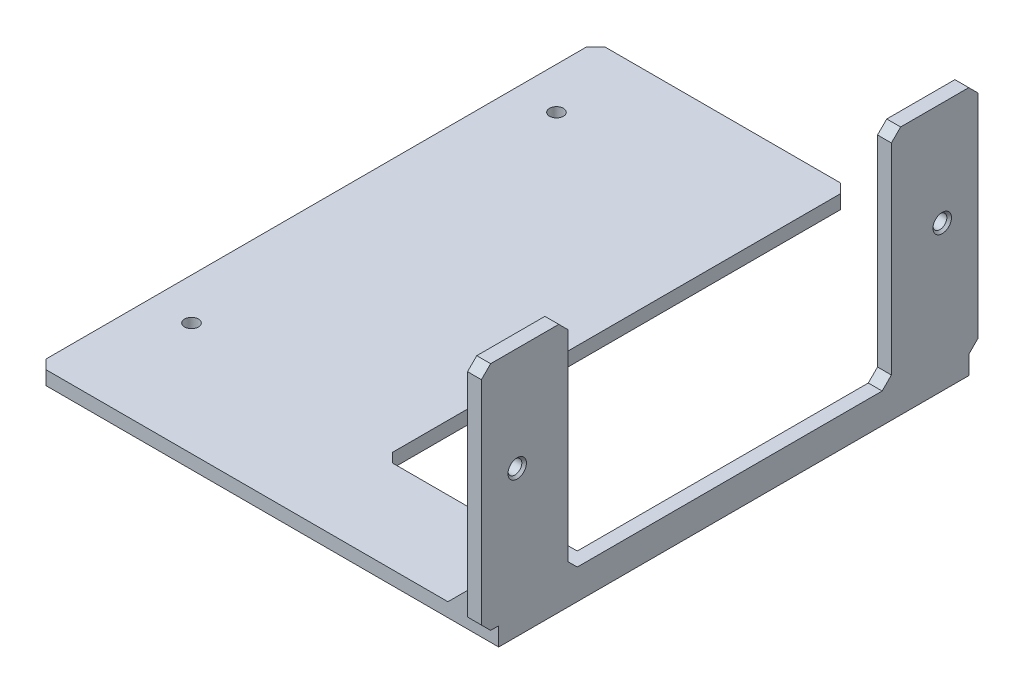
ISO-10303-21;
HEADER;
FILE_DESCRIPTION(('STEP AP214'),'2;1');
FILE_NAME('part.step','',(''),(''),'','','');
FILE_SCHEMA(('AUTOMOTIVE_DESIGN { 1 0 10303 214 1 1 1 1 }'));
ENDSEC;
DATA;
#1=APPLICATION_CONTEXT('core data for automotive mechanical design processes');
#2=APPLICATION_PROTOCOL_DEFINITION('international standard','automotive_design',2000,#1);
#3=PRODUCT_CONTEXT('',#1,'mechanical');
#4=PRODUCT('Part','Part','',(#3));
#5=PRODUCT_RELATED_PRODUCT_CATEGORY('part','',(#4));
#6=PRODUCT_DEFINITION_FORMATION('','',#4);
#7=PRODUCT_DEFINITION_CONTEXT('part definition',#1,'design');
#8=PRODUCT_DEFINITION('design','',#6,#7);
#9=PRODUCT_DEFINITION_SHAPE('','',#8);
#10=(LENGTH_UNIT() NAMED_UNIT(*) SI_UNIT(.MILLI.,.METRE.));
#11=(NAMED_UNIT(*) PLANE_ANGLE_UNIT() SI_UNIT($,.RADIAN.));
#12=(NAMED_UNIT(*) SI_UNIT($,.STERADIAN.) SOLID_ANGLE_UNIT());
#13=UNCERTAINTY_MEASURE_WITH_UNIT(LENGTH_MEASURE(1.E-05),#10,'distance_accuracy_value','');
#14=(GEOMETRIC_REPRESENTATION_CONTEXT(3) GLOBAL_UNCERTAINTY_ASSIGNED_CONTEXT((#13)) GLOBAL_UNIT_ASSIGNED_CONTEXT((#10,
#11,#12)) REPRESENTATION_CONTEXT('',''));
#15=CARTESIAN_POINT('',(0.,0.,0.));
#16=DIRECTION('',(0.,0.,1.));
#17=DIRECTION('',(1.,0.,0.));
#18=AXIS2_PLACEMENT_3D('',#15,#16,#17);
#19=CARTESIAN_POINT('',(0.,-27.5,30.));
#20=DIRECTION('',(0.,0.,-1.));
#21=DIRECTION('',(-1.,0.,0.));
#22=AXIS2_PLACEMENT_3D('',#19,#20,#21);
#23=PLANE('',#22);
#24=DIRECTION('',(0.,-1.,0.));
#25=VECTOR('',#24,1.);
#26=CARTESIAN_POINT('',(0.,-28.5,30.));
#27=LINE('',#26,#25);
#28=CARTESIAN_POINT('',(0.,-25.,30.));
#29=VERTEX_POINT('',#28);
#30=CARTESIAN_POINT('',(0.,-31.5,30.));
#31=VERTEX_POINT('',#30);
#32=EDGE_CURVE('E395',#29,#31,#27,.T.);
#33=ORIENTED_EDGE('',*,*,#32,.T.);
#34=DIRECTION('',(1.,0.,0.));
#35=VECTOR('',#34,1.);
#36=CARTESIAN_POINT('',(3.,-31.5,30.));
#37=LINE('',#36,#35);
#38=CARTESIAN_POINT('',(-40.,-31.5,30.));
#39=VERTEX_POINT('',#38);
#40=EDGE_CURVE('E392',#39,#31,#37,.T.);
#41=ORIENTED_EDGE('',*,*,#40,.F.);
#42=DIRECTION('',(0.,1.,0.));
#43=VECTOR('',#42,1.);
#44=CARTESIAN_POINT('',(-40.,-27.5,30.));
#45=LINE('',#44,#43);
#46=CARTESIAN_POINT('',(-40.,-28.5,30.));
#47=VERTEX_POINT('',#46);
#48=EDGE_CURVE('E373',#39,#47,#45,.T.);
#49=ORIENTED_EDGE('',*,*,#48,.T.);
#50=DIRECTION('',(1.,0.,0.));
#51=VECTOR('',#50,1.);
#52=CARTESIAN_POINT('',(3.,-28.5,30.));
#53=LINE('',#52,#51);
#54=CARTESIAN_POINT('',(-8.,-28.5,30.));
#55=VERTEX_POINT('',#54);
#56=EDGE_CURVE('E382',#47,#55,#53,.T.);
#57=ORIENTED_EDGE('',*,*,#56,.T.);
#58=DIRECTION('',(0.707106781186548,0.707106781186547,0.));
#59=VECTOR('',#58,1.);
#60=CARTESIAN_POINT('',(0.,-20.5,30.));
#61=LINE('',#60,#59);
#62=CARTESIAN_POINT('',(-4.5,-25.,30.));
#63=VERTEX_POINT('',#62);
#64=EDGE_CURVE('E534',#55,#63,#61,.T.);
#65=ORIENTED_EDGE('',*,*,#64,.T.);
#66=DIRECTION('',(-1.,0.,0.));
#67=VECTOR('',#66,1.);
#68=CARTESIAN_POINT('',(0.,-25.,30.));
#69=LINE('',#68,#67);
#70=EDGE_CURVE('E513',#29,#63,#69,.T.);
#71=ORIENTED_EDGE('',*,*,#70,.F.);
#72=EDGE_LOOP('',(#33,#41,#49,#57,#65,#71));
#73=FACE_BOUND('',#72,.T.);
#74=ADVANCED_FACE('F43',(#73),#23,.T.);
#75=CARTESIAN_POINT('',(3.,22.5,53.75));
#76=DIRECTION('',(0.,-1.,0.));
#77=DIRECTION('',(0.,0.,-1.));
#78=AXIS2_PLACEMENT_3D('',#75,#76,#77);
#79=PLANE('',#78);
#80=DIRECTION('',(0.,0.,1.));
#81=VECTOR('',#80,1.);
#82=CARTESIAN_POINT('',(3.,22.5,53.75));
#83=LINE('',#82,#81);
#84=CARTESIAN_POINT('',(3.,22.5,37.));
#85=VERTEX_POINT('',#84);
#86=CARTESIAN_POINT('',(3.,22.5,51.75));
#87=VERTEX_POINT('',#86);
#88=EDGE_CURVE('E436',#85,#87,#83,.T.);
#89=ORIENTED_EDGE('',*,*,#88,.F.);
#90=DIRECTION('',(-1.,0.,0.));
#91=VECTOR('',#90,1.);
#92=CARTESIAN_POINT('',(3.,22.5,37.));
#93=LINE('',#92,#91);
#94=CARTESIAN_POINT('',(0.,22.5,37.));
#95=VERTEX_POINT('',#94);
#96=EDGE_CURVE('E341',#85,#95,#93,.T.);
#97=ORIENTED_EDGE('',*,*,#96,.T.);
#98=DIRECTION('',(0.,0.,1.));
#99=VECTOR('',#98,1.);
#100=CARTESIAN_POINT('',(0.,22.5,53.75));
#101=LINE('',#100,#99);
#102=CARTESIAN_POINT('',(0.,22.5,51.75));
#103=VERTEX_POINT('',#102);
#104=EDGE_CURVE('E449',#95,#103,#101,.T.);
#105=ORIENTED_EDGE('',*,*,#104,.T.);
#106=DIRECTION('',(1.,0.,0.));
#107=VECTOR('',#106,1.);
#108=CARTESIAN_POINT('',(3.,22.5,51.75));
#109=LINE('',#108,#107);
#110=EDGE_CURVE('E270',#103,#87,#109,.T.);
#111=ORIENTED_EDGE('',*,*,#110,.T.);
#112=EDGE_LOOP('',(#89,#97,#105,#111));
#113=FACE_BOUND('',#112,.T.);
#114=ADVANCED_FACE('F623',(#113),#79,.F.);
#115=CARTESIAN_POINT('',(0.,0.,0.));
#116=DIRECTION('',(1.,0.,0.));
#117=DIRECTION('',(0.,0.,-1.));
#118=AXIS2_PLACEMENT_3D('',#115,#116,#117);
#119=PLANE('',#118);
#120=CARTESIAN_POINT('',(0.,0.,46.));
#121=DIRECTION('',(1.,0.,0.));
#122=DIRECTION('',(0.,0.,-1.));
#123=AXIS2_PLACEMENT_3D('',#120,#121,#122);
#124=CIRCLE('',#123,1.5);
#125=CARTESIAN_POINT('',(0.,0.,44.5));
#126=VERTEX_POINT('',#125);
#127=EDGE_CURVE('E420',#126,#126,#124,.T.);
#128=ORIENTED_EDGE('',*,*,#127,.T.);
#129=EDGE_LOOP('',(#128));
#130=FACE_BOUND('',#129,.T.);
#131=ORIENTED_EDGE('',*,*,#104,.F.);
#132=DIRECTION('',(0.,0.707106781186545,0.70710678118655));
#133=VECTOR('',#132,1.);
#134=CARTESIAN_POINT('',(0.,20.5,35.));
#135=LINE('',#134,#133);
#136=CARTESIAN_POINT('',(0.,20.5,35.));
#137=VERTEX_POINT('',#136);
#138=EDGE_CURVE('E343',#95,#137,#135,.F.);
#139=ORIENTED_EDGE('',*,*,#138,.T.);
#140=DIRECTION('',(0.,-1.,0.));
#141=VECTOR('',#140,1.);
#142=CARTESIAN_POINT('',(0.,0.,35.));
#143=LINE('',#142,#141);
#144=CARTESIAN_POINT('',(0.,-20.5,35.));
#145=VERTEX_POINT('',#144);
#146=EDGE_CURVE('E498',#137,#145,#143,.T.);
#147=ORIENTED_EDGE('',*,*,#146,.T.);
#148=DIRECTION('',(0.,0.,-1.));
#149=VECTOR('',#148,1.);
#150=CARTESIAN_POINT('',(0.,-20.5,50.));
#151=LINE('',#150,#149);
#152=CARTESIAN_POINT('',(0.,-20.5,50.));
#153=VERTEX_POINT('',#152);
#154=EDGE_CURVE('E409',#153,#145,#151,.T.);
#155=ORIENTED_EDGE('',*,*,#154,.F.);
#156=DIRECTION('',(0.,-1.,0.));
#157=VECTOR('',#156,1.);
#158=CARTESIAN_POINT('',(0.,-28.5,50.));
#159=LINE('',#158,#157);
#160=CARTESIAN_POINT('',(0.,-27.5,50.));
#161=VERTEX_POINT('',#160);
#162=EDGE_CURVE('E531',#153,#161,#159,.T.);
#163=ORIENTED_EDGE('',*,*,#162,.T.);
#164=DIRECTION('',(0.,0.,-1.));
#165=VECTOR('',#164,1.);
#166=CARTESIAN_POINT('',(0.,-27.5,53.75));
#167=LINE('',#166,#165);
#168=CARTESIAN_POINT('',(0.,-27.5,51.75));
#169=VERTEX_POINT('',#168);
#170=EDGE_CURVE('E443',#169,#161,#167,.T.);
#171=ORIENTED_EDGE('',*,*,#170,.F.);
#172=DIRECTION('',(0.,-0.707106781186548,-0.707106781186548));
#173=VECTOR('',#172,1.);
#174=CARTESIAN_POINT('',(0.,-27.5,51.75));
#175=LINE('',#174,#173);
#176=CARTESIAN_POINT('',(0.,-25.5,53.75));
#177=VERTEX_POINT('',#176);
#178=EDGE_CURVE('E457',#169,#177,#175,.F.);
#179=ORIENTED_EDGE('',*,*,#178,.T.);
#180=DIRECTION('',(0.,-1.,0.));
#181=VECTOR('',#180,1.);
#182=CARTESIAN_POINT('',(0.,22.5,53.75));
#183=LINE('',#182,#181);
#184=CARTESIAN_POINT('',(0.,20.5,53.75));
#185=VERTEX_POINT('',#184);
#186=EDGE_CURVE('E424',#185,#177,#183,.T.);
#187=ORIENTED_EDGE('',*,*,#186,.F.);
#188=DIRECTION('',(0.,-0.707106781186548,0.707106781186548));
#189=VECTOR('',#188,1.);
#190=CARTESIAN_POINT('',(0.,20.5,53.75));
#191=LINE('',#190,#189);
#192=EDGE_CURVE('E454',#185,#103,#191,.F.);
#193=ORIENTED_EDGE('',*,*,#192,.T.);
#194=EDGE_LOOP('',(#131,#139,#147,#155,#163,#171,#179,#187,#193));
#195=FACE_BOUND('',#194,.T.);
#196=ADVANCED_FACE('F478',(#130,#195),#119,.F.);
#197=CARTESIAN_POINT('',(3.,-27.5,53.75));
#198=DIRECTION('',(0.,1.,0.));
#199=DIRECTION('',(0.,0.,1.));
#200=AXIS2_PLACEMENT_3D('',#197,#198,#199);
#201=PLANE('',#200);
#202=ORIENTED_EDGE('',*,*,#170,.T.);
#203=DIRECTION('',(1.,0.,0.));
#204=VECTOR('',#203,1.);
#205=CARTESIAN_POINT('',(0.,-27.5,50.));
#206=LINE('',#205,#204);
#207=CARTESIAN_POINT('',(3.,-27.5,50.));
#208=VERTEX_POINT('',#207);
#209=EDGE_CURVE('E417',#161,#208,#206,.T.);
#210=ORIENTED_EDGE('',*,*,#209,.T.);
#211=DIRECTION('',(0.,0.,-1.));
#212=VECTOR('',#211,1.);
#213=CARTESIAN_POINT('',(3.,-27.5,53.75));
#214=LINE('',#213,#212);
#215=CARTESIAN_POINT('',(3.,-27.5,51.75));
#216=VERTEX_POINT('',#215);
#217=EDGE_CURVE('E430',#216,#208,#214,.T.);
#218=ORIENTED_EDGE('',*,*,#217,.F.);
#219=DIRECTION('',(-1.,0.,0.));
#220=VECTOR('',#219,1.);
#221=CARTESIAN_POINT('',(3.,-27.5,51.75));
#222=LINE('',#221,#220);
#223=EDGE_CURVE('E264',#216,#169,#222,.T.);
#224=ORIENTED_EDGE('',*,*,#223,.T.);
#225=EDGE_LOOP('',(#202,#210,#218,#224));
#226=FACE_BOUND('',#225,.T.);
#227=ADVANCED_FACE('F472',(#226),#201,.F.);
#228=CARTESIAN_POINT('',(3.,22.5,53.75));
#229=DIRECTION('',(0.,0.,-1.));
#230=DIRECTION('',(0.,1.,0.));
#231=AXIS2_PLACEMENT_3D('',#228,#229,#230);
#232=PLANE('',#231);
#233=ORIENTED_EDGE('',*,*,#186,.T.);
#234=DIRECTION('',(1.,0.,0.));
#235=VECTOR('',#234,1.);
#236=CARTESIAN_POINT('',(3.,-25.5,53.75));
#237=LINE('',#236,#235);
#238=CARTESIAN_POINT('',(3.,-25.5,53.75));
#239=VERTEX_POINT('',#238);
#240=EDGE_CURVE('E285',#177,#239,#237,.T.);
#241=ORIENTED_EDGE('',*,*,#240,.T.);
#242=DIRECTION('',(0.,-1.,0.));
#243=VECTOR('',#242,1.);
#244=CARTESIAN_POINT('',(3.,22.5,53.75));
#245=LINE('',#244,#243);
#246=CARTESIAN_POINT('',(3.,20.5,53.75));
#247=VERTEX_POINT('',#246);
#248=EDGE_CURVE('E427',#247,#239,#245,.T.);
#249=ORIENTED_EDGE('',*,*,#248,.F.);
#250=DIRECTION('',(-1.,0.,0.));
#251=VECTOR('',#250,1.);
#252=CARTESIAN_POINT('',(3.,20.5,53.75));
#253=LINE('',#252,#251);
#254=EDGE_CURVE('E282',#247,#185,#253,.T.);
#255=ORIENTED_EDGE('',*,*,#254,.T.);
#256=EDGE_LOOP('',(#233,#241,#249,#255));
#257=FACE_BOUND('',#256,.T.);
#258=ADVANCED_FACE('F481',(#257),#232,.F.);
#259=CARTESIAN_POINT('',(3.,22.5,-53.75));
#260=DIRECTION('',(0.,0.,1.));
#261=DIRECTION('',(0.,-1.,0.));
#262=AXIS2_PLACEMENT_3D('',#259,#260,#261);
#263=PLANE('',#262);
#264=DIRECTION('',(0.,1.,0.));
#265=VECTOR('',#264,1.);
#266=CARTESIAN_POINT('',(3.,22.5,-53.75));
#267=LINE('',#266,#265);
#268=CARTESIAN_POINT('',(3.,-25.5,-53.75));
#269=VERTEX_POINT('',#268);
#270=CARTESIAN_POINT('',(3.,20.5,-53.75));
#271=VERTEX_POINT('',#270);
#272=EDGE_CURVE('E434',#269,#271,#267,.T.);
#273=ORIENTED_EDGE('',*,*,#272,.F.);
#274=DIRECTION('',(-1.,0.,0.));
#275=VECTOR('',#274,1.);
#276=CARTESIAN_POINT('',(3.,-25.5,-53.75));
#277=LINE('',#276,#275);
#278=CARTESIAN_POINT('',(0.,-25.5,-53.75));
#279=VERTEX_POINT('',#278);
#280=EDGE_CURVE('E269',#269,#279,#277,.T.);
#281=ORIENTED_EDGE('',*,*,#280,.T.);
#282=DIRECTION('',(0.,1.,0.));
#283=VECTOR('',#282,1.);
#284=CARTESIAN_POINT('',(0.,22.5,-53.75));
#285=LINE('',#284,#283);
#286=CARTESIAN_POINT('',(0.,20.5,-53.75));
#287=VERTEX_POINT('',#286);
#288=EDGE_CURVE('E446',#279,#287,#285,.T.);
#289=ORIENTED_EDGE('',*,*,#288,.T.);
#290=DIRECTION('',(1.,0.,0.));
#291=VECTOR('',#290,1.);
#292=CARTESIAN_POINT('',(3.,20.5,-53.75));
#293=LINE('',#292,#291);
#294=EDGE_CURVE('E440',#287,#271,#293,.T.);
#295=ORIENTED_EDGE('',*,*,#294,.T.);
#296=EDGE_LOOP('',(#273,#281,#289,#295));
#297=FACE_BOUND('',#296,.T.);
#298=ADVANCED_FACE('F613',(#297),#263,.F.);
#299=CARTESIAN_POINT('',(0.,22.5,-51.75));
#300=VERTEX_POINT('',#299);
#301=CARTESIAN_POINT('',(0.,22.5,-37.));
#302=VERTEX_POINT('',#301);
#303=EDGE_CURVE('E431',#300,#302,#101,.T.);
#304=ORIENTED_EDGE('',*,*,#303,.T.);
#305=DIRECTION('',(1.,0.,0.));
#306=VECTOR('',#305,1.);
#307=CARTESIAN_POINT('',(3.,22.5,-37.));
#308=LINE('',#307,#306);
#309=CARTESIAN_POINT('',(3.,22.5,-37.));
#310=VERTEX_POINT('',#309);
#311=EDGE_CURVE('E327',#302,#310,#308,.T.);
#312=ORIENTED_EDGE('',*,*,#311,.T.);
#313=CARTESIAN_POINT('',(3.,22.5,-51.75));
#314=VERTEX_POINT('',#313);
#315=EDGE_CURVE('E437',#314,#310,#83,.T.);
#316=ORIENTED_EDGE('',*,*,#315,.F.);
#317=DIRECTION('',(-1.,0.,0.));
#318=VECTOR('',#317,1.);
#319=CARTESIAN_POINT('',(3.,22.5,-51.75));
#320=LINE('',#319,#318);
#321=EDGE_CURVE('E274',#314,#300,#320,.T.);
#322=ORIENTED_EDGE('',*,*,#321,.T.);
#323=EDGE_LOOP('',(#304,#312,#316,#322));
#324=FACE_BOUND('',#323,.T.);
#325=ADVANCED_FACE('F605',(#324),#79,.F.);
#326=CARTESIAN_POINT('',(3.,0.,0.));
#327=DIRECTION('',(1.,0.,0.));
#328=DIRECTION('',(0.,0.,-1.));
#329=AXIS2_PLACEMENT_3D('',#326,#327,#328);
#330=PLANE('',#329);
#331=DIRECTION('',(0.,1.,0.));
#332=VECTOR('',#331,1.);
#333=CARTESIAN_POINT('',(3.,-113.305027351624,-51.75));
#334=LINE('',#333,#332);
#335=CARTESIAN_POINT('',(3.,-31.5,-51.75));
#336=VERTEX_POINT('',#335);
#337=CARTESIAN_POINT('',(3.,-27.5,-51.75));
#338=VERTEX_POINT('',#337);
#339=EDGE_CURVE('E241',#336,#338,#334,.T.);
#340=ORIENTED_EDGE('',*,*,#339,.T.);
#341=DIRECTION('',(0.,-0.707106781186545,0.70710678118655));
#342=VECTOR('',#341,1.);
#343=CARTESIAN_POINT('',(3.,-39.6250000000001,-39.6249999999998));
#344=LINE('',#343,#342);
#345=EDGE_CURVE('E247',#338,#269,#344,.F.);
#346=ORIENTED_EDGE('',*,*,#345,.T.);
#347=ORIENTED_EDGE('',*,*,#272,.T.);
#348=DIRECTION('',(0.,-0.70710678118655,-0.707106781186545));
#349=VECTOR('',#348,1.);
#350=CARTESIAN_POINT('',(3.,37.1249999999999,-37.1250000000002));
#351=LINE('',#350,#349);
#352=EDGE_CURVE('E271',#271,#314,#351,.F.);
#353=ORIENTED_EDGE('',*,*,#352,.T.);
#354=ORIENTED_EDGE('',*,*,#315,.T.);
#355=DIRECTION('',(0.,0.707106781186552,-0.707106781186543));
#356=VECTOR('',#355,1.);
#357=CARTESIAN_POINT('',(3.,-7.25000000000013,-7.25000000000023));
#358=LINE('',#357,#356);
#359=CARTESIAN_POINT('',(3.,20.5,-35.));
#360=VERTEX_POINT('',#359);
#361=EDGE_CURVE('E332',#310,#360,#358,.F.);
#362=ORIENTED_EDGE('',*,*,#361,.T.);
#363=DIRECTION('',(0.,1.,0.));
#364=VECTOR('',#363,1.);
#365=CARTESIAN_POINT('',(3.,22.5,-35.));
#366=LINE('',#365,#364);
#367=CARTESIAN_POINT('',(3.,-23.,-35.));
#368=VERTEX_POINT('',#367);
#369=EDGE_CURVE('E506',#368,#360,#366,.T.);
#370=ORIENTED_EDGE('',*,*,#369,.F.);
#371=DIRECTION('',(0.,0.70710678118655,-0.707106781186545));
#372=VECTOR('',#371,1.);
#373=CARTESIAN_POINT('',(3.,-23.,-35.));
#374=LINE('',#373,#372);
#375=CARTESIAN_POINT('',(3.,-25.,-33.));
#376=VERTEX_POINT('',#375);
#377=EDGE_CURVE('E318',#368,#376,#374,.F.);
#378=ORIENTED_EDGE('',*,*,#377,.T.);
#379=DIRECTION('',(0.,0.,-1.));
#380=VECTOR('',#379,1.);
#381=CARTESIAN_POINT('',(3.,-25.,35.));
#382=LINE('',#381,#380);
#383=CARTESIAN_POINT('',(3.,-25.,33.));
#384=VERTEX_POINT('',#383);
#385=EDGE_CURVE('E502',#384,#376,#382,.T.);
#386=ORIENTED_EDGE('',*,*,#385,.F.);
#387=DIRECTION('',(0.,-0.707106781186543,-0.707106781186552));
#388=VECTOR('',#387,1.);
#389=CARTESIAN_POINT('',(3.,-25.,33.));
#390=LINE('',#389,#388);
#391=CARTESIAN_POINT('',(3.,-23.,35.));
#392=VERTEX_POINT('',#391);
#393=EDGE_CURVE('E322',#384,#392,#390,.F.);
#394=ORIENTED_EDGE('',*,*,#393,.T.);
#395=DIRECTION('',(0.,-1.,0.));
#396=VECTOR('',#395,1.);
#397=CARTESIAN_POINT('',(3.,22.5,35.));
#398=LINE('',#397,#396);
#399=CARTESIAN_POINT('',(3.,20.5,35.));
#400=VERTEX_POINT('',#399);
#401=EDGE_CURVE('E497',#400,#392,#398,.T.);
#402=ORIENTED_EDGE('',*,*,#401,.F.);
#403=DIRECTION('',(0.,-0.707106781186545,-0.70710678118655));
#404=VECTOR('',#403,1.);
#405=CARTESIAN_POINT('',(3.,-7.24999999999993,7.24999999999989));
#406=LINE('',#405,#404);
#407=EDGE_CURVE('E330',#400,#85,#406,.F.);
#408=ORIENTED_EDGE('',*,*,#407,.T.);
#409=ORIENTED_EDGE('',*,*,#88,.T.);
#410=DIRECTION('',(0.,0.707106781186548,-0.707106781186548));
#411=VECTOR('',#410,1.);
#412=CARTESIAN_POINT('',(3.,37.125,37.125));
#413=LINE('',#412,#411);
#414=EDGE_CURVE('E263',#87,#247,#413,.F.);
#415=ORIENTED_EDGE('',*,*,#414,.T.);
#416=ORIENTED_EDGE('',*,*,#248,.T.);
#417=DIRECTION('',(0.,0.707106781186548,0.707106781186548));
#418=VECTOR('',#417,1.);
#419=CARTESIAN_POINT('',(3.,-39.625,39.625));
#420=LINE('',#419,#418);
#421=EDGE_CURVE('E276',#239,#216,#420,.F.);
#422=ORIENTED_EDGE('',*,*,#421,.T.);
#423=ORIENTED_EDGE('',*,*,#217,.T.);
#424=DIRECTION('',(0.,-1.,0.));
#425=VECTOR('',#424,1.);
#426=CARTESIAN_POINT('',(3.,-27.5,50.));
#427=LINE('',#426,#425);
#428=CARTESIAN_POINT('',(3.,-31.5,50.));
#429=VERTEX_POINT('',#428);
#430=EDGE_CURVE('E399',#208,#429,#427,.T.);
#431=ORIENTED_EDGE('',*,*,#430,.T.);
#432=DIRECTION('',(0.,0.,1.));
#433=VECTOR('',#432,1.);
#434=CARTESIAN_POINT('',(3.,-31.5,50.));
#435=LINE('',#434,#433);
#436=EDGE_CURVE('E250',#336,#429,#435,.T.);
#437=ORIENTED_EDGE('',*,*,#436,.F.);
#438=EDGE_LOOP('',(#340,#346,#347,#353,#354,#362,#370,#378,#386,#394,#402,#408,#409,#415,#416,
#422,#423,#431,#437));
#439=FACE_BOUND('',#438,.T.);
#440=CARTESIAN_POINT('',(3.,0.,46.));
#441=DIRECTION('',(1.,0.,0.));
#442=DIRECTION('',(0.,0.,-1.));
#443=AXIS2_PLACEMENT_3D('',#440,#441,#442);
#444=CIRCLE('',#443,2.00000000000002);
#445=CARTESIAN_POINT('',(3.,0.,44.));
#446=VERTEX_POINT('',#445);
#447=EDGE_CURVE('E293',#446,#446,#444,.F.);
#448=ORIENTED_EDGE('',*,*,#447,.T.);
#449=EDGE_LOOP('',(#448));
#450=FACE_BOUND('',#449,.T.);
#451=CARTESIAN_POINT('',(3.,0.,-46.));
#452=DIRECTION('',(1.,0.,0.));
#453=DIRECTION('',(0.,0.,-1.));
#454=AXIS2_PLACEMENT_3D('',#451,#452,#453);
#455=CIRCLE('',#454,2.00000000000002);
#456=CARTESIAN_POINT('',(3.,0.,-48.));
#457=VERTEX_POINT('',#456);
#458=EDGE_CURVE('E290',#457,#457,#455,.F.);
#459=ORIENTED_EDGE('',*,*,#458,.T.);
#460=EDGE_LOOP('',(#459));
#461=FACE_BOUND('',#460,.T.);
#462=ADVANCED_FACE('F243',(#439,#450,#461),#330,.T.);
#463=CARTESIAN_POINT('',(0.,0.,-46.));
#464=DIRECTION('',(1.,0.,0.));
#465=DIRECTION('',(0.,0.,-1.));
#466=AXIS2_PLACEMENT_3D('',#463,#464,#465);
#467=CIRCLE('',#466,1.5);
#468=CARTESIAN_POINT('',(0.,0.,-47.5));
#469=VERTEX_POINT('',#468);
#470=EDGE_CURVE('E421',#469,#469,#467,.T.);
#471=ORIENTED_EDGE('',*,*,#470,.T.);
#472=EDGE_LOOP('',(#471));
#473=FACE_BOUND('',#472,.T.);
#474=DIRECTION('',(0.,1.,0.));
#475=VECTOR('',#474,1.);
#476=CARTESIAN_POINT('',(0.,0.,-35.));
#477=LINE('',#476,#475);
#478=CARTESIAN_POINT('',(0.,-23.,-35.));
#479=VERTEX_POINT('',#478);
#480=CARTESIAN_POINT('',(0.,20.5,-35.));
#481=VERTEX_POINT('',#480);
#482=EDGE_CURVE('E305',#479,#481,#477,.T.);
#483=ORIENTED_EDGE('',*,*,#482,.T.);
#484=DIRECTION('',(0.,-0.707106781186552,0.707106781186543));
#485=VECTOR('',#484,1.);
#486=CARTESIAN_POINT('',(0.,22.5,-37.));
#487=LINE('',#486,#485);
#488=EDGE_CURVE('E336',#481,#302,#487,.F.);
#489=ORIENTED_EDGE('',*,*,#488,.T.);
#490=ORIENTED_EDGE('',*,*,#303,.F.);
#491=DIRECTION('',(0.,0.70710678118655,0.707106781186545));
#492=VECTOR('',#491,1.);
#493=CARTESIAN_POINT('',(0.,22.5,-51.75));
#494=LINE('',#493,#492);
#495=EDGE_CURVE('E459',#300,#287,#494,.F.);
#496=ORIENTED_EDGE('',*,*,#495,.T.);
#497=ORIENTED_EDGE('',*,*,#288,.F.);
#498=DIRECTION('',(0.,0.707106781186545,-0.70710678118655));
#499=VECTOR('',#498,1.);
#500=CARTESIAN_POINT('',(0.,-25.5,-53.75));
#501=LINE('',#500,#499);
#502=CARTESIAN_POINT('',(0.,-27.5,-51.75));
#503=VERTEX_POINT('',#502);
#504=EDGE_CURVE('E461',#279,#503,#501,.F.);
#505=ORIENTED_EDGE('',*,*,#504,.T.);
#506=DIRECTION('',(0.,1.,0.));
#507=VECTOR('',#506,1.);
#508=CARTESIAN_POINT('',(0.,-113.305027351624,-51.75));
#509=LINE('',#508,#507);
#510=CARTESIAN_POINT('',(0.,-31.5,-51.75));
#511=VERTEX_POINT('',#510);
#512=EDGE_CURVE('E255',#511,#503,#509,.T.);
#513=ORIENTED_EDGE('',*,*,#512,.F.);
#514=DIRECTION('',(0.,0.,1.));
#515=VECTOR('',#514,1.);
#516=CARTESIAN_POINT('',(0.,-31.5,30.));
#517=LINE('',#516,#515);
#518=EDGE_CURVE('E254',#511,#31,#517,.T.);
#519=ORIENTED_EDGE('',*,*,#518,.T.);
#520=ORIENTED_EDGE('',*,*,#32,.F.);
#521=DIRECTION('',(0.,0.,-1.));
#522=VECTOR('',#521,1.);
#523=CARTESIAN_POINT('',(0.,-25.,0.));
#524=LINE('',#523,#522);
#525=CARTESIAN_POINT('',(0.,-25.,-33.));
#526=VERTEX_POINT('',#525);
#527=EDGE_CURVE('E515',#29,#526,#524,.T.);
#528=ORIENTED_EDGE('',*,*,#527,.T.);
#529=DIRECTION('',(0.,-0.70710678118655,0.707106781186545));
#530=VECTOR('',#529,1.);
#531=CARTESIAN_POINT('',(0.,-28.9999999999999,-29.0000000000001));
#532=LINE('',#531,#530);
#533=EDGE_CURVE('E320',#526,#479,#532,.F.);
#534=ORIENTED_EDGE('',*,*,#533,.T.);
#535=EDGE_LOOP('',(#483,#489,#490,#496,#497,#505,#513,#519,#520,#528,#534));
#536=FACE_BOUND('',#535,.T.);
#537=ADVANCED_FACE('F582',(#473,#536),#119,.F.);
#538=CARTESIAN_POINT('',(3.,-25.5,-53.75));
#539=DIRECTION('',(0.,0.70710678118655,0.707106781186545));
#540=DIRECTION('',(-1.,0.,0.));
#541=AXIS2_PLACEMENT_3D('',#538,#539,#540);
#542=PLANE('',#541);
#543=ORIENTED_EDGE('',*,*,#345,.F.);
#544=DIRECTION('',(1.,0.,0.));
#545=VECTOR('',#544,1.);
#546=CARTESIAN_POINT('',(3.,-27.5,-51.75));
#547=LINE('',#546,#545);
#548=EDGE_CURVE('E258',#503,#338,#547,.T.);
#549=ORIENTED_EDGE('',*,*,#548,.F.);
#550=ORIENTED_EDGE('',*,*,#504,.F.);
#551=ORIENTED_EDGE('',*,*,#280,.F.);
#552=EDGE_LOOP('',(#543,#549,#550,#551));
#553=FACE_BOUND('',#552,.T.);
#554=ADVANCED_FACE('F267',(#553),#542,.F.);
#555=CARTESIAN_POINT('',(3.,22.5,-51.75));
#556=DIRECTION('',(0.,-0.707106781186545,0.70710678118655));
#557=DIRECTION('',(-1.,0.,0.));
#558=AXIS2_PLACEMENT_3D('',#555,#556,#557);
#559=PLANE('',#558);
#560=ORIENTED_EDGE('',*,*,#352,.F.);
#561=ORIENTED_EDGE('',*,*,#294,.F.);
#562=ORIENTED_EDGE('',*,*,#495,.F.);
#563=ORIENTED_EDGE('',*,*,#321,.F.);
#564=EDGE_LOOP('',(#560,#561,#562,#563));
#565=FACE_BOUND('',#564,.T.);
#566=ADVANCED_FACE('F610',(#565),#559,.F.);
#567=CARTESIAN_POINT('',(3.,-27.5,51.75));
#568=DIRECTION('',(0.,0.707106781186547,-0.707106781186547));
#569=DIRECTION('',(-1.,0.,0.));
#570=AXIS2_PLACEMENT_3D('',#567,#568,#569);
#571=PLANE('',#570);
#572=ORIENTED_EDGE('',*,*,#421,.F.);
#573=ORIENTED_EDGE('',*,*,#240,.F.);
#574=ORIENTED_EDGE('',*,*,#178,.F.);
#575=ORIENTED_EDGE('',*,*,#223,.F.);
#576=EDGE_LOOP('',(#572,#573,#574,#575));
#577=FACE_BOUND('',#576,.T.);
#578=ADVANCED_FACE('F474',(#577),#571,.F.);
#579=CARTESIAN_POINT('',(3.,20.5,53.75));
#580=DIRECTION('',(0.,-0.707106781186547,-0.707106781186547));
#581=DIRECTION('',(-1.,0.,0.));
#582=AXIS2_PLACEMENT_3D('',#579,#580,#581);
#583=PLANE('',#582);
#584=ORIENTED_EDGE('',*,*,#414,.F.);
#585=ORIENTED_EDGE('',*,*,#110,.F.);
#586=ORIENTED_EDGE('',*,*,#192,.F.);
#587=ORIENTED_EDGE('',*,*,#254,.F.);
#588=EDGE_LOOP('',(#584,#585,#586,#587));
#589=FACE_BOUND('',#588,.T.);
#590=ADVANCED_FACE('F485',(#589),#583,.F.);
#591=CARTESIAN_POINT('',(0.,0.,46.));
#592=DIRECTION('',(1.,0.,0.));
#593=DIRECTION('',(0.,0.,-1.));
#594=AXIS2_PLACEMENT_3D('',#591,#592,#593);
#595=CYLINDRICAL_SURFACE('',#594,1.5);
#596=CARTESIAN_POINT('',(2.49999999999998,0.,46.));
#597=DIRECTION('',(1.,0.,0.));
#598=DIRECTION('',(0.,0.,-1.));
#599=AXIS2_PLACEMENT_3D('',#596,#597,#598);
#600=CIRCLE('',#599,1.5);
#601=CARTESIAN_POINT('',(2.49999999999998,0.,44.5));
#602=VERTEX_POINT('',#601);
#603=EDGE_CURVE('E287',#602,#602,#600,.T.);
#604=ORIENTED_EDGE('',*,*,#603,.T.);
#605=EDGE_LOOP('',(#604));
#606=FACE_BOUND('',#605,.T.);
#607=ORIENTED_EDGE('',*,*,#127,.F.);
#608=EDGE_LOOP('',(#607));
#609=FACE_BOUND('',#608,.T.);
#610=ADVANCED_FACE('F643',(#606,#609),#595,.F.);
#611=CARTESIAN_POINT('',(0.,0.,-46.));
#612=DIRECTION('',(1.,0.,0.));
#613=DIRECTION('',(0.,0.,-1.));
#614=AXIS2_PLACEMENT_3D('',#611,#612,#613);
#615=CYLINDRICAL_SURFACE('',#614,1.5);
#616=CARTESIAN_POINT('',(2.49999999999998,0.,-46.));
#617=DIRECTION('',(1.,0.,0.));
#618=DIRECTION('',(0.,0.,-1.));
#619=AXIS2_PLACEMENT_3D('',#616,#617,#618);
#620=CIRCLE('',#619,1.5);
#621=CARTESIAN_POINT('',(2.49999999999998,0.,-47.5));
#622=VERTEX_POINT('',#621);
#623=EDGE_CURVE('E296',#622,#622,#620,.T.);
#624=ORIENTED_EDGE('',*,*,#623,.T.);
#625=EDGE_LOOP('',(#624));
#626=FACE_BOUND('',#625,.T.);
#627=ORIENTED_EDGE('',*,*,#470,.F.);
#628=EDGE_LOOP('',(#627));
#629=FACE_BOUND('',#628,.T.);
#630=ADVANCED_FACE('F639',(#626,#629),#615,.F.);
#631=CARTESIAN_POINT('',(2.49999999999998,0.,46.));
#632=DIRECTION('',(1.,0.,0.));
#633=DIRECTION('',(0.,0.,-1.));
#634=AXIS2_PLACEMENT_3D('',#631,#632,#633);
#635=CONICAL_SURFACE('',#634,1.5,0.785398163397443);
#636=ORIENTED_EDGE('',*,*,#447,.F.);
#637=EDGE_LOOP('',(#636));
#638=FACE_BOUND('',#637,.T.);
#639=ORIENTED_EDGE('',*,*,#603,.F.);
#640=EDGE_LOOP('',(#639));
#641=FACE_BOUND('',#640,.T.);
#642=ADVANCED_FACE('F642',(#638,#641),#635,.F.);
#643=CARTESIAN_POINT('',(2.49999999999998,0.,-46.));
#644=DIRECTION('',(1.,0.,0.));
#645=DIRECTION('',(0.,0.,-1.));
#646=AXIS2_PLACEMENT_3D('',#643,#644,#645);
#647=CONICAL_SURFACE('',#646,1.5,0.785398163397443);
#648=ORIENTED_EDGE('',*,*,#458,.F.);
#649=EDGE_LOOP('',(#648));
#650=FACE_BOUND('',#649,.T.);
#651=ORIENTED_EDGE('',*,*,#623,.F.);
#652=EDGE_LOOP('',(#651));
#653=FACE_BOUND('',#652,.T.);
#654=ADVANCED_FACE('F638',(#650,#653),#647,.F.);
#655=CARTESIAN_POINT('',(0.,-27.5,50.));
#656=DIRECTION('',(0.,0.,1.));
#657=DIRECTION('',(1.,0.,0.));
#658=AXIS2_PLACEMENT_3D('',#655,#656,#657);
#659=PLANE('',#658);
#660=DIRECTION('',(-1.,0.,0.));
#661=VECTOR('',#660,1.);
#662=CARTESIAN_POINT('',(-97.,-28.5,50.));
#663=LINE('',#662,#661);
#664=CARTESIAN_POINT('',(-8.,-28.5,50.));
#665=VERTEX_POINT('',#664);
#666=CARTESIAN_POINT('',(-95.,-28.5,50.));
#667=VERTEX_POINT('',#666);
#668=EDGE_CURVE('E405',#665,#667,#663,.T.);
#669=ORIENTED_EDGE('',*,*,#668,.T.);
#670=DIRECTION('',(0.,-1.,0.));
#671=VECTOR('',#670,1.);
#672=CARTESIAN_POINT('',(-95.,-31.5,50.));
#673=LINE('',#672,#671);
#674=CARTESIAN_POINT('',(-95.,-31.5,50.));
#675=VERTEX_POINT('',#674);
#676=EDGE_CURVE('E356',#667,#675,#673,.T.);
#677=ORIENTED_EDGE('',*,*,#676,.T.);
#678=DIRECTION('',(-1.,0.,0.));
#679=VECTOR('',#678,1.);
#680=CARTESIAN_POINT('',(-97.,-31.5,50.));
#681=LINE('',#680,#679);
#682=EDGE_CURVE('E415',#429,#675,#681,.T.);
#683=ORIENTED_EDGE('',*,*,#682,.F.);
#684=ORIENTED_EDGE('',*,*,#430,.F.);
#685=ORIENTED_EDGE('',*,*,#209,.F.);
#686=ORIENTED_EDGE('',*,*,#162,.F.);
#687=DIRECTION('',(0.707106781186548,0.707106781186547,0.));
#688=VECTOR('',#687,1.);
#689=CARTESIAN_POINT('',(0.,-20.5,50.));
#690=LINE('',#689,#688);
#691=EDGE_CURVE('E533',#665,#153,#690,.T.);
#692=ORIENTED_EDGE('',*,*,#691,.F.);
#693=EDGE_LOOP('',(#669,#677,#683,#684,#685,#686,#692));
#694=FACE_BOUND('',#693,.T.);
#695=ADVANCED_FACE('F572',(#694),#659,.T.);
#696=CARTESIAN_POINT('',(-97.,-31.5,50.));
#697=DIRECTION('',(1.,0.,0.));
#698=DIRECTION('',(0.,0.,-1.));
#699=AXIS2_PLACEMENT_3D('',#696,#697,#698);
#700=PLANE('',#699);
#701=DIRECTION('',(0.,0.,-1.));
#702=VECTOR('',#701,1.);
#703=CARTESIAN_POINT('',(-97.,-31.5,50.));
#704=LINE('',#703,#702);
#705=CARTESIAN_POINT('',(-97.,-31.5,48.));
#706=VERTEX_POINT('',#705);
#707=CARTESIAN_POINT('',(-97.,-31.5,-69.));
#708=VERTEX_POINT('',#707);
#709=EDGE_CURVE('E544',#706,#708,#704,.T.);
#710=ORIENTED_EDGE('',*,*,#709,.F.);
#711=DIRECTION('',(0.,1.,0.));
#712=VECTOR('',#711,1.);
#713=CARTESIAN_POINT('',(-97.,-28.5,48.));
#714=LINE('',#713,#712);
#715=CARTESIAN_POINT('',(-97.,-28.5,48.));
#716=VERTEX_POINT('',#715);
#717=EDGE_CURVE('E347',#706,#716,#714,.T.);
#718=ORIENTED_EDGE('',*,*,#717,.T.);
#719=DIRECTION('',(0.,0.,-1.));
#720=VECTOR('',#719,1.);
#721=CARTESIAN_POINT('',(-97.,-28.5,50.));
#722=LINE('',#721,#720);
#723=CARTESIAN_POINT('',(-97.,-28.5,-69.));
#724=VERTEX_POINT('',#723);
#725=EDGE_CURVE('E408',#716,#724,#722,.T.);
#726=ORIENTED_EDGE('',*,*,#725,.T.);
#727=DIRECTION('',(0.,-1.,0.));
#728=VECTOR('',#727,1.);
#729=CARTESIAN_POINT('',(-97.,-31.5,-69.));
#730=LINE('',#729,#728);
#731=EDGE_CURVE('E345',#724,#708,#730,.T.);
#732=ORIENTED_EDGE('',*,*,#731,.T.);
#733=EDGE_LOOP('',(#710,#718,#726,#732));
#734=FACE_BOUND('',#733,.T.);
#735=ADVANCED_FACE('F563',(#734),#700,.F.);
#736=CARTESIAN_POINT('',(-97.,-31.5,-71.));
#737=DIRECTION('',(0.,0.,1.));
#738=DIRECTION('',(1.,0.,0.));
#739=AXIS2_PLACEMENT_3D('',#736,#737,#738);
#740=PLANE('',#739);
#741=DIRECTION('',(1.,0.,0.));
#742=VECTOR('',#741,1.);
#743=CARTESIAN_POINT('',(-97.,-31.5,-71.));
#744=LINE('',#743,#742);
#745=CARTESIAN_POINT('',(-94.9999999999999,-31.5,-71.));
#746=VERTEX_POINT('',#745);
#747=CARTESIAN_POINT('',(-44.,-31.5,-71.));
#748=VERTEX_POINT('',#747);
#749=EDGE_CURVE('E401',#746,#748,#744,.T.);
#750=ORIENTED_EDGE('',*,*,#749,.F.);
#751=DIRECTION('',(0.,1.,0.));
#752=VECTOR('',#751,1.);
#753=CARTESIAN_POINT('',(-94.9999999999999,-31.5,-71.));
#754=LINE('',#753,#752);
#755=CARTESIAN_POINT('',(-94.9999999999999,-28.5,-71.));
#756=VERTEX_POINT('',#755);
#757=EDGE_CURVE('E366',#746,#756,#754,.T.);
#758=ORIENTED_EDGE('',*,*,#757,.T.);
#759=DIRECTION('',(1.,0.,0.));
#760=VECTOR('',#759,1.);
#761=CARTESIAN_POINT('',(-97.,-28.5,-71.));
#762=LINE('',#761,#760);
#763=CARTESIAN_POINT('',(-44.,-28.5,-71.));
#764=VERTEX_POINT('',#763);
#765=EDGE_CURVE('E387',#756,#764,#762,.T.);
#766=ORIENTED_EDGE('',*,*,#765,.T.);
#767=DIRECTION('',(0.,-1.,0.));
#768=VECTOR('',#767,1.);
#769=CARTESIAN_POINT('',(-44.,-31.5,-71.));
#770=LINE('',#769,#768);
#771=EDGE_CURVE('E364',#764,#748,#770,.T.);
#772=ORIENTED_EDGE('',*,*,#771,.T.);
#773=EDGE_LOOP('',(#750,#758,#766,#772));
#774=FACE_BOUND('',#773,.T.);
#775=ADVANCED_FACE('F557',(#774),#740,.F.);
#776=CARTESIAN_POINT('',(-42.,-31.5,30.));
#777=DIRECTION('',(-1.,0.,0.));
#778=DIRECTION('',(0.,0.,1.));
#779=AXIS2_PLACEMENT_3D('',#776,#777,#778);
#780=PLANE('',#779);
#781=DIRECTION('',(0.,0.,1.));
#782=VECTOR('',#781,1.);
#783=CARTESIAN_POINT('',(-42.,-31.5,30.));
#784=LINE('',#783,#782);
#785=CARTESIAN_POINT('',(-42.,-31.5,-69.));
#786=VERTEX_POINT('',#785);
#787=CARTESIAN_POINT('',(-42.,-31.5,28.));
#788=VERTEX_POINT('',#787);
#789=EDGE_CURVE('E397',#786,#788,#784,.T.);
#790=ORIENTED_EDGE('',*,*,#789,.F.);
#791=DIRECTION('',(0.,1.,0.));
#792=VECTOR('',#791,1.);
#793=CARTESIAN_POINT('',(-42.,-31.5,-69.));
#794=LINE('',#793,#792);
#795=CARTESIAN_POINT('',(-42.,-28.5,-69.));
#796=VERTEX_POINT('',#795);
#797=EDGE_CURVE('E370',#786,#796,#794,.T.);
#798=ORIENTED_EDGE('',*,*,#797,.T.);
#799=DIRECTION('',(0.,0.,1.));
#800=VECTOR('',#799,1.);
#801=CARTESIAN_POINT('',(-42.,-28.5,30.));
#802=LINE('',#801,#800);
#803=CARTESIAN_POINT('',(-42.,-28.5,28.));
#804=VERTEX_POINT('',#803);
#805=EDGE_CURVE('E380',#796,#804,#802,.T.);
#806=ORIENTED_EDGE('',*,*,#805,.T.);
#807=DIRECTION('',(0.,-1.,0.));
#808=VECTOR('',#807,1.);
#809=CARTESIAN_POINT('',(-42.,-31.5,28.));
#810=LINE('',#809,#808);
#811=EDGE_CURVE('E65',#804,#788,#810,.T.);
#812=ORIENTED_EDGE('',*,*,#811,.T.);
#813=EDGE_LOOP('',(#790,#798,#806,#812));
#814=FACE_BOUND('',#813,.T.);
#815=ADVANCED_FACE('F385',(#814),#780,.F.);
#816=CARTESIAN_POINT('',(0.,-31.5,0.));
#817=DIRECTION('',(0.,1.,0.));
#818=DIRECTION('',(0.,0.,1.));
#819=AXIS2_PLACEMENT_3D('',#816,#817,#818);
#820=PLANE('',#819);
#821=CARTESIAN_POINT('',(-88.,-31.5,-53.5));
#822=DIRECTION('',(0.,1.,0.));
#823=DIRECTION('',(0.,0.,1.));
#824=AXIS2_PLACEMENT_3D('',#821,#822,#823);
#825=CIRCLE('',#824,1.5);
#826=CARTESIAN_POINT('',(-88.,-31.5,-52.));
#827=VERTEX_POINT('',#826);
#828=EDGE_CURVE('E528',#827,#827,#825,.T.);
#829=ORIENTED_EDGE('',*,*,#828,.T.);
#830=EDGE_LOOP('',(#829));
#831=FACE_BOUND('',#830,.T.);
#832=CARTESIAN_POINT('',(-88.,-31.5,25.5));
#833=DIRECTION('',(0.,1.,0.));
#834=DIRECTION('',(0.,0.,1.));
#835=AXIS2_PLACEMENT_3D('',#832,#833,#834);
#836=CIRCLE('',#835,1.5);
#837=CARTESIAN_POINT('',(-88.,-31.5,27.));
#838=VERTEX_POINT('',#837);
#839=EDGE_CURVE('E523',#838,#838,#836,.T.);
#840=ORIENTED_EDGE('',*,*,#839,.T.);
#841=EDGE_LOOP('',(#840));
#842=FACE_BOUND('',#841,.T.);
#843=ORIENTED_EDGE('',*,*,#682,.T.);
#844=DIRECTION('',(-0.70710678118655,0.,-0.707106781186545));
#845=VECTOR('',#844,1.);
#846=CARTESIAN_POINT('',(-97.,-31.5,48.));
#847=LINE('',#846,#845);
#848=EDGE_CURVE('E362',#675,#706,#847,.T.);
#849=ORIENTED_EDGE('',*,*,#848,.T.);
#850=ORIENTED_EDGE('',*,*,#709,.T.);
#851=DIRECTION('',(-0.707106781186548,0.,0.707106781186548));
#852=VECTOR('',#851,1.);
#853=CARTESIAN_POINT('',(-94.9999999999999,-31.5,-71.));
#854=LINE('',#853,#852);
#855=EDGE_CURVE('E360',#708,#746,#854,.F.);
#856=ORIENTED_EDGE('',*,*,#855,.T.);
#857=ORIENTED_EDGE('',*,*,#749,.T.);
#858=DIRECTION('',(-0.70710678118655,0.,-0.707106781186545));
#859=VECTOR('',#858,1.);
#860=CARTESIAN_POINT('',(-42.,-31.5,-69.));
#861=LINE('',#860,#859);
#862=EDGE_CURVE('E358',#748,#786,#861,.F.);
#863=ORIENTED_EDGE('',*,*,#862,.T.);
#864=ORIENTED_EDGE('',*,*,#789,.T.);
#865=DIRECTION('',(0.707106781186552,0.,0.707106781186543));
#866=VECTOR('',#865,1.);
#867=CARTESIAN_POINT('',(-34.9999999999997,-31.5,35.0000000000002));
#868=LINE('',#867,#866);
#869=EDGE_CURVE('E11',#788,#39,#868,.T.);
#870=ORIENTED_EDGE('',*,*,#869,.T.);
#871=ORIENTED_EDGE('',*,*,#40,.T.);
#872=ORIENTED_EDGE('',*,*,#518,.F.);
#873=DIRECTION('',(-1.,0.,0.));
#874=VECTOR('',#873,1.);
#875=CARTESIAN_POINT('',(0.,-31.5,-51.75));
#876=LINE('',#875,#874);
#877=EDGE_CURVE('E503',#336,#511,#876,.T.);
#878=ORIENTED_EDGE('',*,*,#877,.F.);
#879=ORIENTED_EDGE('',*,*,#436,.T.);
#880=EDGE_LOOP('',(#843,#849,#850,#856,#857,#863,#864,#870,#871,#872,#878,#879));
#881=FACE_BOUND('',#880,.T.);
#882=ADVANCED_FACE('F549',(#831,#842,#881),#820,.F.);
#883=CARTESIAN_POINT('',(0.,-28.5,0.));
#884=DIRECTION('',(0.,1.,0.));
#885=DIRECTION('',(0.,0.,1.));
#886=AXIS2_PLACEMENT_3D('',#883,#884,#885);
#887=PLANE('',#886);
#888=CARTESIAN_POINT('',(-88.,-28.5,-53.5));
#889=DIRECTION('',(0.,1.,0.));
#890=DIRECTION('',(0.,0.,1.));
#891=AXIS2_PLACEMENT_3D('',#888,#889,#890);
#892=CIRCLE('',#891,1.5);
#893=CARTESIAN_POINT('',(-88.,-28.5,-52.));
#894=VERTEX_POINT('',#893);
#895=EDGE_CURVE('E520',#894,#894,#892,.T.);
#896=ORIENTED_EDGE('',*,*,#895,.F.);
#897=EDGE_LOOP('',(#896));
#898=FACE_BOUND('',#897,.T.);
#899=CARTESIAN_POINT('',(-88.,-28.5,25.5));
#900=DIRECTION('',(0.,1.,0.));
#901=DIRECTION('',(0.,0.,1.));
#902=AXIS2_PLACEMENT_3D('',#899,#900,#901);
#903=CIRCLE('',#902,1.5);
#904=CARTESIAN_POINT('',(-88.,-28.5,27.));
#905=VERTEX_POINT('',#904);
#906=EDGE_CURVE('E519',#905,#905,#903,.T.);
#907=ORIENTED_EDGE('',*,*,#906,.F.);
#908=EDGE_LOOP('',(#907));
#909=FACE_BOUND('',#908,.T.);
#910=ORIENTED_EDGE('',*,*,#725,.F.);
#911=DIRECTION('',(0.70710678118655,0.,0.707106781186545));
#912=VECTOR('',#911,1.);
#913=CARTESIAN_POINT('',(-72.4999999999996,-28.5,72.5000000000002));
#914=LINE('',#913,#912);
#915=EDGE_CURVE('E354',#716,#667,#914,.T.);
#916=ORIENTED_EDGE('',*,*,#915,.T.);
#917=ORIENTED_EDGE('',*,*,#668,.F.);
#918=DIRECTION('',(0.,0.,-1.));
#919=VECTOR('',#918,1.);
#920=CARTESIAN_POINT('',(-8.,-28.5,50.));
#921=LINE('',#920,#919);
#922=EDGE_CURVE('E536',#665,#55,#921,.T.);
#923=ORIENTED_EDGE('',*,*,#922,.T.);
#924=ORIENTED_EDGE('',*,*,#56,.F.);
#925=DIRECTION('',(-0.707106781186552,0.,-0.707106781186543));
#926=VECTOR('',#925,1.);
#927=CARTESIAN_POINT('',(-40.,-28.5,30.));
#928=LINE('',#927,#926);
#929=EDGE_CURVE('E52',#47,#804,#928,.T.);
#930=ORIENTED_EDGE('',*,*,#929,.T.);
#931=ORIENTED_EDGE('',*,*,#805,.F.);
#932=DIRECTION('',(0.70710678118655,0.,0.707106781186545));
#933=VECTOR('',#932,1.);
#934=CARTESIAN_POINT('',(13.5000000000002,-28.5,-13.5000000000003));
#935=LINE('',#934,#933);
#936=EDGE_CURVE('E350',#796,#764,#935,.F.);
#937=ORIENTED_EDGE('',*,*,#936,.T.);
#938=ORIENTED_EDGE('',*,*,#765,.F.);
#939=DIRECTION('',(0.707106781186548,0.,-0.707106781186548));
#940=VECTOR('',#939,1.);
#941=CARTESIAN_POINT('',(-83.,-28.5,-83.));
#942=LINE('',#941,#940);
#943=EDGE_CURVE('E352',#756,#724,#942,.F.);
#944=ORIENTED_EDGE('',*,*,#943,.T.);
#945=EDGE_LOOP('',(#910,#916,#917,#923,#924,#930,#931,#937,#938,#944));
#946=FACE_BOUND('',#945,.T.);
#947=ADVANCED_FACE('F379',(#898,#909,#946),#887,.T.);
#948=CARTESIAN_POINT('',(0.,-20.5,50.));
#949=DIRECTION('',(-0.707106781186547,0.707106781186548,0.));
#950=DIRECTION('',(-0.707106781186548,-0.707106781186547,0.));
#951=AXIS2_PLACEMENT_3D('',#948,#949,#950);
#952=PLANE('',#951);
#953=DIRECTION('',(0.707106781186548,0.707106781186547,0.));
#954=VECTOR('',#953,1.);
#955=CARTESIAN_POINT('',(0.,-20.5,35.));
#956=LINE('',#955,#954);
#957=CARTESIAN_POINT('',(-2.50000000000001,-23.,35.));
#958=VERTEX_POINT('',#957);
#959=EDGE_CURVE('E302',#958,#145,#956,.T.);
#960=ORIENTED_EDGE('',*,*,#959,.F.);
#961=DIRECTION('',(0.577350269189624,0.577350269189623,0.577350269189631));
#962=VECTOR('',#961,1.);
#963=CARTESIAN_POINT('',(-5.33333333333333,-25.8333333333333,32.1666666666667));
#964=LINE('',#963,#962);
#965=CARTESIAN_POINT('',(-4.5,-25.,33.));
#966=VERTEX_POINT('',#965);
#967=EDGE_CURVE('E325',#958,#966,#964,.F.);
#968=ORIENTED_EDGE('',*,*,#967,.T.);
#969=DIRECTION('',(0.,0.,1.));
#970=VECTOR('',#969,1.);
#971=CARTESIAN_POINT('',(-4.5,-25.,50.));
#972=LINE('',#971,#970);
#973=EDGE_CURVE('E299',#63,#966,#972,.T.);
#974=ORIENTED_EDGE('',*,*,#973,.F.);
#975=ORIENTED_EDGE('',*,*,#64,.F.);
#976=ORIENTED_EDGE('',*,*,#922,.F.);
#977=ORIENTED_EDGE('',*,*,#691,.T.);
#978=ORIENTED_EDGE('',*,*,#154,.T.);
#979=EDGE_LOOP('',(#960,#968,#974,#975,#976,#977,#978));
#980=FACE_BOUND('',#979,.T.);
#981=ADVANCED_FACE('F578',(#980),#952,.T.);
#982=CARTESIAN_POINT('',(-88.,-58.5,25.5));
#983=DIRECTION('',(0.,1.,0.));
#984=DIRECTION('',(0.,0.,1.));
#985=AXIS2_PLACEMENT_3D('',#982,#983,#984);
#986=CYLINDRICAL_SURFACE('',#985,1.5);
#987=ORIENTED_EDGE('',*,*,#906,.T.);
#988=EDGE_LOOP('',(#987));
#989=FACE_BOUND('',#988,.T.);
#990=ORIENTED_EDGE('',*,*,#839,.F.);
#991=EDGE_LOOP('',(#990));
#992=FACE_BOUND('',#991,.T.);
#993=ADVANCED_FACE('F746',(#989,#992),#986,.F.);
#994=CARTESIAN_POINT('',(-88.,-58.5,-53.5));
#995=DIRECTION('',(0.,1.,0.));
#996=DIRECTION('',(0.,0.,1.));
#997=AXIS2_PLACEMENT_3D('',#994,#995,#996);
#998=CYLINDRICAL_SURFACE('',#997,1.5);
#999=ORIENTED_EDGE('',*,*,#895,.T.);
#1000=EDGE_LOOP('',(#999));
#1001=FACE_BOUND('',#1000,.T.);
#1002=ORIENTED_EDGE('',*,*,#828,.F.);
#1003=EDGE_LOOP('',(#1002));
#1004=FACE_BOUND('',#1003,.T.);
#1005=ADVANCED_FACE('F739',(#1001,#1004),#998,.F.);
#1006=CARTESIAN_POINT('',(-7.,22.5,-35.));
#1007=DIRECTION('',(0.,0.,-1.));
#1008=DIRECTION('',(0.,1.,0.));
#1009=AXIS2_PLACEMENT_3D('',#1006,#1007,#1008);
#1010=PLANE('',#1009);
#1011=ORIENTED_EDGE('',*,*,#369,.T.);
#1012=DIRECTION('',(-1.,0.,0.));
#1013=VECTOR('',#1012,1.);
#1014=CARTESIAN_POINT('',(-7.,20.5,-35.));
#1015=LINE('',#1014,#1013);
#1016=EDGE_CURVE('E334',#360,#481,#1015,.T.);
#1017=ORIENTED_EDGE('',*,*,#1016,.T.);
#1018=ORIENTED_EDGE('',*,*,#482,.F.);
#1019=DIRECTION('',(1.,0.,0.));
#1020=VECTOR('',#1019,1.);
#1021=CARTESIAN_POINT('',(3.,-23.,-35.));
#1022=LINE('',#1021,#1020);
#1023=EDGE_CURVE('E308',#479,#368,#1022,.T.);
#1024=ORIENTED_EDGE('',*,*,#1023,.T.);
#1025=EDGE_LOOP('',(#1011,#1017,#1018,#1024));
#1026=FACE_BOUND('',#1025,.T.);
#1027=ADVANCED_FACE('F596',(#1026),#1010,.F.);
#1028=CARTESIAN_POINT('',(-7.,22.5,35.));
#1029=DIRECTION('',(0.,0.,1.));
#1030=DIRECTION('',(0.,-1.,0.));
#1031=AXIS2_PLACEMENT_3D('',#1028,#1029,#1030);
#1032=PLANE('',#1031);
#1033=ORIENTED_EDGE('',*,*,#146,.F.);
#1034=DIRECTION('',(1.,0.,0.));
#1035=VECTOR('',#1034,1.);
#1036=CARTESIAN_POINT('',(-7.,20.5,35.));
#1037=LINE('',#1036,#1035);
#1038=EDGE_CURVE('E338',#137,#400,#1037,.T.);
#1039=ORIENTED_EDGE('',*,*,#1038,.T.);
#1040=ORIENTED_EDGE('',*,*,#401,.T.);
#1041=DIRECTION('',(-1.,0.,0.));
#1042=VECTOR('',#1041,1.);
#1043=CARTESIAN_POINT('',(-4.5,-23.,35.));
#1044=LINE('',#1043,#1042);
#1045=EDGE_CURVE('E316',#392,#958,#1044,.T.);
#1046=ORIENTED_EDGE('',*,*,#1045,.T.);
#1047=ORIENTED_EDGE('',*,*,#959,.T.);
#1048=EDGE_LOOP('',(#1033,#1039,#1040,#1046,#1047));
#1049=FACE_BOUND('',#1048,.T.);
#1050=ADVANCED_FACE('F496',(#1049),#1032,.F.);
#1051=CARTESIAN_POINT('',(-7.,-25.,35.));
#1052=DIRECTION('',(0.,-1.,0.));
#1053=DIRECTION('',(0.,0.,-1.));
#1054=AXIS2_PLACEMENT_3D('',#1051,#1052,#1053);
#1055=PLANE('',#1054);
#1056=ORIENTED_EDGE('',*,*,#385,.T.);
#1057=DIRECTION('',(-1.,0.,0.));
#1058=VECTOR('',#1057,1.);
#1059=CARTESIAN_POINT('',(0.,-25.,-33.));
#1060=LINE('',#1059,#1058);
#1061=EDGE_CURVE('E314',#376,#526,#1060,.T.);
#1062=ORIENTED_EDGE('',*,*,#1061,.T.);
#1063=ORIENTED_EDGE('',*,*,#527,.F.);
#1064=ORIENTED_EDGE('',*,*,#70,.T.);
#1065=ORIENTED_EDGE('',*,*,#973,.T.);
#1066=DIRECTION('',(1.,0.,0.));
#1067=VECTOR('',#1066,1.);
#1068=CARTESIAN_POINT('',(3.,-25.,33.));
#1069=LINE('',#1068,#1067);
#1070=EDGE_CURVE('E311',#966,#384,#1069,.T.);
#1071=ORIENTED_EDGE('',*,*,#1070,.T.);
#1072=EDGE_LOOP('',(#1056,#1062,#1063,#1064,#1065,#1071));
#1073=FACE_BOUND('',#1072,.T.);
#1074=ADVANCED_FACE('F588',(#1073),#1055,.F.);
#1075=CARTESIAN_POINT('',(-7.,-23.,-35.));
#1076=DIRECTION('',(0.,0.707106781186545,0.70710678118655));
#1077=DIRECTION('',(-1.,0.,0.));
#1078=AXIS2_PLACEMENT_3D('',#1075,#1076,#1077);
#1079=PLANE('',#1078);
#1080=ORIENTED_EDGE('',*,*,#533,.F.);
#1081=ORIENTED_EDGE('',*,*,#1061,.F.);
#1082=ORIENTED_EDGE('',*,*,#377,.F.);
#1083=ORIENTED_EDGE('',*,*,#1023,.F.);
#1084=EDGE_LOOP('',(#1080,#1081,#1082,#1083));
#1085=FACE_BOUND('',#1084,.T.);
#1086=ADVANCED_FACE('F593',(#1085),#1079,.T.);
#1087=CARTESIAN_POINT('',(-7.,-25.,33.));
#1088=DIRECTION('',(0.,0.707106781186552,-0.707106781186543));
#1089=DIRECTION('',(-1.,0.,0.));
#1090=AXIS2_PLACEMENT_3D('',#1087,#1088,#1089);
#1091=PLANE('',#1090);
#1092=ORIENTED_EDGE('',*,*,#967,.F.);
#1093=ORIENTED_EDGE('',*,*,#1045,.F.);
#1094=ORIENTED_EDGE('',*,*,#393,.F.);
#1095=ORIENTED_EDGE('',*,*,#1070,.F.);
#1096=EDGE_LOOP('',(#1092,#1093,#1094,#1095));
#1097=FACE_BOUND('',#1096,.T.);
#1098=ADVANCED_FACE('F587',(#1097),#1091,.T.);
#1099=CARTESIAN_POINT('',(3.,22.5,-37.));
#1100=DIRECTION('',(0.,-0.707106781186543,-0.707106781186552));
#1101=DIRECTION('',(1.,0.,0.));
#1102=AXIS2_PLACEMENT_3D('',#1099,#1100,#1101);
#1103=PLANE('',#1102);
#1104=ORIENTED_EDGE('',*,*,#488,.F.);
#1105=ORIENTED_EDGE('',*,*,#1016,.F.);
#1106=ORIENTED_EDGE('',*,*,#361,.F.);
#1107=ORIENTED_EDGE('',*,*,#311,.F.);
#1108=EDGE_LOOP('',(#1104,#1105,#1106,#1107));
#1109=FACE_BOUND('',#1108,.T.);
#1110=ADVANCED_FACE('F602',(#1109),#1103,.F.);
#1111=CARTESIAN_POINT('',(-7.,20.5,35.));
#1112=DIRECTION('',(0.,-0.70710678118655,0.707106781186545));
#1113=DIRECTION('',(1.,0.,0.));
#1114=AXIS2_PLACEMENT_3D('',#1111,#1112,#1113);
#1115=PLANE('',#1114);
#1116=ORIENTED_EDGE('',*,*,#138,.F.);
#1117=ORIENTED_EDGE('',*,*,#96,.F.);
#1118=ORIENTED_EDGE('',*,*,#407,.F.);
#1119=ORIENTED_EDGE('',*,*,#1038,.F.);
#1120=EDGE_LOOP('',(#1116,#1117,#1118,#1119));
#1121=FACE_BOUND('',#1120,.T.);
#1122=ADVANCED_FACE('F493',(#1121),#1115,.F.);
#1123=CARTESIAN_POINT('',(-97.,-31.5,48.));
#1124=DIRECTION('',(-0.707106781186545,0.,0.70710678118655));
#1125=DIRECTION('',(0.,-1.,0.));
#1126=AXIS2_PLACEMENT_3D('',#1123,#1124,#1125);
#1127=PLANE('',#1126);
#1128=ORIENTED_EDGE('',*,*,#848,.F.);
#1129=ORIENTED_EDGE('',*,*,#676,.F.);
#1130=ORIENTED_EDGE('',*,*,#915,.F.);
#1131=ORIENTED_EDGE('',*,*,#717,.F.);
#1132=EDGE_LOOP('',(#1128,#1129,#1130,#1131));
#1133=FACE_BOUND('',#1132,.T.);
#1134=ADVANCED_FACE('F567',(#1133),#1127,.T.);
#1135=CARTESIAN_POINT('',(-94.9999999999999,-31.5,-71.));
#1136=DIRECTION('',(0.707106781186547,0.,0.707106781186547));
#1137=DIRECTION('',(0.,1.,0.));
#1138=AXIS2_PLACEMENT_3D('',#1135,#1136,#1137);
#1139=PLANE('',#1138);
#1140=ORIENTED_EDGE('',*,*,#855,.F.);
#1141=ORIENTED_EDGE('',*,*,#731,.F.);
#1142=ORIENTED_EDGE('',*,*,#943,.F.);
#1143=ORIENTED_EDGE('',*,*,#757,.F.);
#1144=EDGE_LOOP('',(#1140,#1141,#1142,#1143));
#1145=FACE_BOUND('',#1144,.T.);
#1146=ADVANCED_FACE('F559',(#1145),#1139,.F.);
#1147=CARTESIAN_POINT('',(-42.,-31.5,-69.));
#1148=DIRECTION('',(-0.707106781186545,0.,0.70710678118655));
#1149=DIRECTION('',(0.,1.,0.));
#1150=AXIS2_PLACEMENT_3D('',#1147,#1148,#1149);
#1151=PLANE('',#1150);
#1152=ORIENTED_EDGE('',*,*,#862,.F.);
#1153=ORIENTED_EDGE('',*,*,#771,.F.);
#1154=ORIENTED_EDGE('',*,*,#936,.F.);
#1155=ORIENTED_EDGE('',*,*,#797,.F.);
#1156=EDGE_LOOP('',(#1152,#1153,#1154,#1155));
#1157=FACE_BOUND('',#1156,.T.);
#1158=ADVANCED_FACE('F555',(#1157),#1151,.F.);
#1159=CARTESIAN_POINT('',(-40.,-27.5,30.));
#1160=DIRECTION('',(-0.707106781186542,0.,0.707106781186552));
#1161=DIRECTION('',(0.,1.,0.));
#1162=AXIS2_PLACEMENT_3D('',#1159,#1160,#1161);
#1163=PLANE('',#1162);
#1164=ORIENTED_EDGE('',*,*,#869,.F.);
#1165=ORIENTED_EDGE('',*,*,#811,.F.);
#1166=ORIENTED_EDGE('',*,*,#929,.F.);
#1167=ORIENTED_EDGE('',*,*,#48,.F.);
#1168=EDGE_LOOP('',(#1164,#1165,#1166,#1167));
#1169=FACE_BOUND('',#1168,.T.);
#1170=ADVANCED_FACE('F46',(#1169),#1163,.F.);
#1171=CARTESIAN_POINT('',(0.,-113.305027351624,-51.75));
#1172=DIRECTION('',(0.,0.,1.));
#1173=DIRECTION('',(1.,0.,0.));
#1174=AXIS2_PLACEMENT_3D('',#1171,#1172,#1173);
#1175=PLANE('',#1174);
#1176=ORIENTED_EDGE('',*,*,#339,.F.);
#1177=ORIENTED_EDGE('',*,*,#877,.T.);
#1178=ORIENTED_EDGE('',*,*,#512,.T.);
#1179=ORIENTED_EDGE('',*,*,#548,.T.);
#1180=EDGE_LOOP('',(#1176,#1177,#1178,#1179));
#1181=FACE_BOUND('',#1180,.T.);
#1182=ADVANCED_FACE('F259',(#1181),#1175,.F.);
#1183=CLOSED_SHELL('',(#74,#114,#196,#227,#258,#298,#325,#462,#537,#554,#566,#578,#590,#610,
#630,#642,#654,#695,#735,#775,#815,#882,#947,#981,#993,#1005,#1027,#1050,#1074,#1086,#1098,
#1110,#1122,#1134,#1146,#1158,#1170,#1182));
#1184=MANIFOLD_SOLID_BREP('B2',#1183);
#1185=ADVANCED_BREP_SHAPE_REPRESENTATION('',(#18,#1184),#14);
#1186=SHAPE_DEFINITION_REPRESENTATION(#9,#1185);
ENDSEC;
END-ISO-10303-21;
